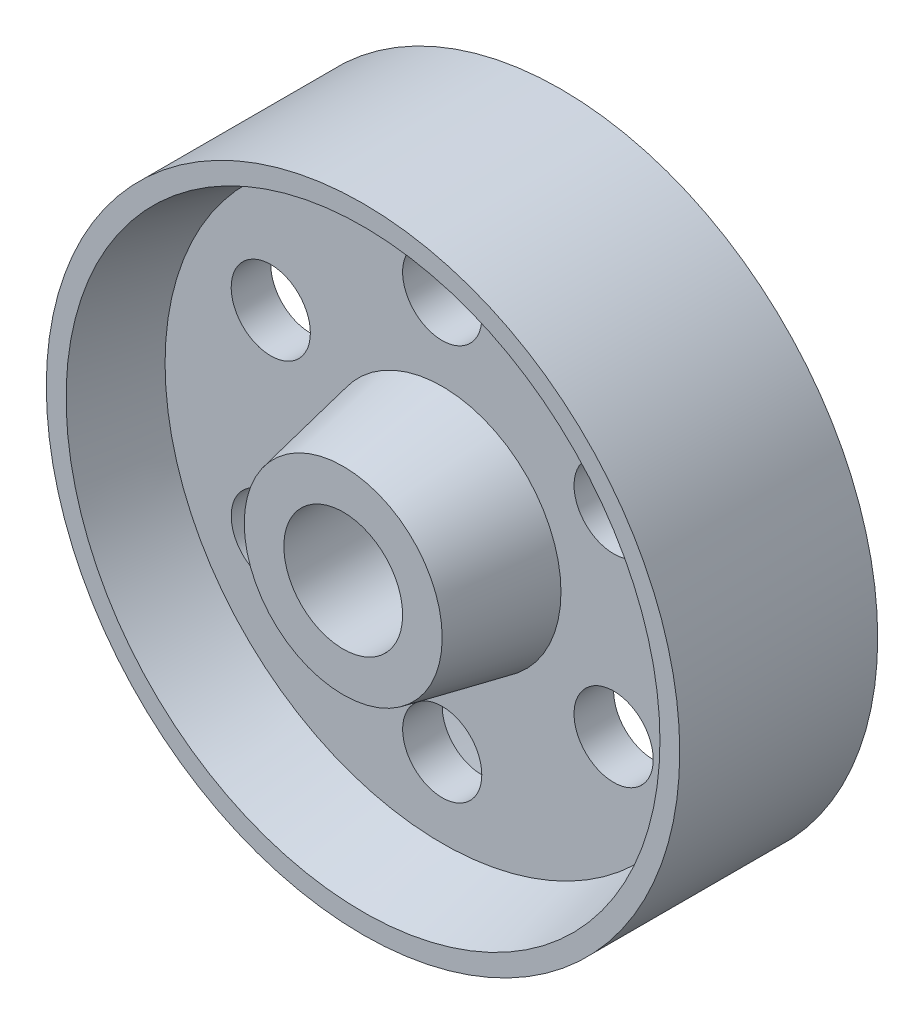
ISO-10303-21;
HEADER;
FILE_DESCRIPTION(('STEP AP214'),'2;1');
FILE_NAME('part.step','',(''),(''),'','','');
FILE_SCHEMA(('AUTOMOTIVE_DESIGN { 1 0 10303 214 1 1 1 1 }'));
ENDSEC;
DATA;
#1=APPLICATION_CONTEXT('core data for automotive mechanical design processes');
#2=APPLICATION_PROTOCOL_DEFINITION('international standard','automotive_design',2000,#1);
#3=PRODUCT_CONTEXT('',#1,'mechanical');
#4=PRODUCT('Part','Part','',(#3));
#5=PRODUCT_RELATED_PRODUCT_CATEGORY('part','',(#4));
#6=PRODUCT_DEFINITION_FORMATION('','',#4);
#7=PRODUCT_DEFINITION_CONTEXT('part definition',#1,'design');
#8=PRODUCT_DEFINITION('design','',#6,#7);
#9=PRODUCT_DEFINITION_SHAPE('','',#8);
#10=(LENGTH_UNIT() NAMED_UNIT(*) SI_UNIT(.MILLI.,.METRE.));
#11=(NAMED_UNIT(*) PLANE_ANGLE_UNIT() SI_UNIT($,.RADIAN.));
#12=(NAMED_UNIT(*) SI_UNIT($,.STERADIAN.) SOLID_ANGLE_UNIT());
#13=UNCERTAINTY_MEASURE_WITH_UNIT(LENGTH_MEASURE(1.E-05),#10,'distance_accuracy_value','');
#14=(GEOMETRIC_REPRESENTATION_CONTEXT(3) GLOBAL_UNCERTAINTY_ASSIGNED_CONTEXT((#13)) GLOBAL_UNIT_ASSIGNED_CONTEXT((#10,
#11,#12)) REPRESENTATION_CONTEXT('',''));
#15=CARTESIAN_POINT('',(0.,0.,0.));
#16=DIRECTION('',(0.,0.,1.));
#17=DIRECTION('',(1.,0.,0.));
#18=AXIS2_PLACEMENT_3D('',#15,#16,#17);
#19=CARTESIAN_POINT('',(0.,0.,37.3088610403316));
#20=DIRECTION('',(0.,0.,1.));
#21=DIRECTION('',(1.,0.,0.));
#22=AXIS2_PLACEMENT_3D('',#19,#20,#21);
#23=CYLINDRICAL_SURFACE('',#22,9.52500000000001);
#24=CARTESIAN_POINT('',(0.,0.,19.05));
#25=DIRECTION('',(0.,0.,1.));
#26=DIRECTION('',(1.,0.,0.));
#27=AXIS2_PLACEMENT_3D('',#24,#25,#26);
#28=CIRCLE('',#27,9.52500000000001);
#29=CARTESIAN_POINT('',(9.52500000000001,0.,19.05));
#30=VERTEX_POINT('',#29);
#31=EDGE_CURVE('E71',#30,#30,#28,.T.);
#32=ORIENTED_EDGE('',*,*,#31,.T.);
#33=EDGE_LOOP('',(#32));
#34=FACE_BOUND('',#33,.T.);
#35=CARTESIAN_POINT('',(0.,0.,-19.05));
#36=DIRECTION('',(0.,0.,1.));
#37=DIRECTION('',(1.,0.,0.));
#38=AXIS2_PLACEMENT_3D('',#35,#36,#37);
#39=CIRCLE('',#38,9.52500000000001);
#40=CARTESIAN_POINT('',(9.52500000000001,0.,-19.05));
#41=VERTEX_POINT('',#40);
#42=EDGE_CURVE('E10',#41,#41,#39,.T.);
#43=ORIENTED_EDGE('',*,*,#42,.F.);
#44=EDGE_LOOP('',(#43));
#45=FACE_BOUND('',#44,.T.);
#46=ADVANCED_FACE('F31',(#34,#45),#23,.F.);
#47=CARTESIAN_POINT('',(0.,0.,-19.05));
#48=DIRECTION('',(0.,0.,1.));
#49=DIRECTION('',(1.,0.,0.));
#50=AXIS2_PLACEMENT_3D('',#47,#48,#49);
#51=PLANE('',#50);
#52=CARTESIAN_POINT('',(0.,0.,-19.05));
#53=DIRECTION('',(0.,0.,1.));
#54=DIRECTION('',(1.,0.,0.));
#55=AXIS2_PLACEMENT_3D('',#52,#53,#54);
#56=CIRCLE('',#55,15.875);
#57=CARTESIAN_POINT('',(15.875,0.,-19.05));
#58=VERTEX_POINT('',#57);
#59=EDGE_CURVE('E37',#58,#58,#56,.T.);
#60=ORIENTED_EDGE('',*,*,#59,.F.);
#61=EDGE_LOOP('',(#60));
#62=FACE_BOUND('',#61,.T.);
#63=ORIENTED_EDGE('',*,*,#42,.T.);
#64=EDGE_LOOP('',(#63));
#65=FACE_BOUND('',#64,.T.);
#66=ADVANCED_FACE('F143',(#62,#65),#51,.F.);
#67=CARTESIAN_POINT('',(0.,0.,-19.05));
#68=DIRECTION('',(0.,0.,1.));
#69=DIRECTION('',(1.,0.,0.));
#70=AXIS2_PLACEMENT_3D('',#67,#68,#69);
#71=CONICAL_SURFACE('',#70,15.875,0.197395559849881);
#72=CARTESIAN_POINT('',(0.,0.,-3.175));
#73=DIRECTION('',(0.,0.,1.));
#74=DIRECTION('',(1.,0.,0.));
#75=AXIS2_PLACEMENT_3D('',#72,#73,#74);
#76=CIRCLE('',#75,19.05);
#77=CARTESIAN_POINT('',(19.05,0.,-3.175));
#78=VERTEX_POINT('',#77);
#79=EDGE_CURVE('E41',#78,#78,#76,.T.);
#80=ORIENTED_EDGE('',*,*,#79,.F.);
#81=EDGE_LOOP('',(#80));
#82=FACE_BOUND('',#81,.T.);
#83=ORIENTED_EDGE('',*,*,#59,.T.);
#84=EDGE_LOOP('',(#83));
#85=FACE_BOUND('',#84,.T.);
#86=ADVANCED_FACE('F147',(#82,#85),#71,.T.);
#87=CARTESIAN_POINT('',(0.,0.,-3.175));
#88=DIRECTION('',(0.,0.,1.));
#89=DIRECTION('',(1.,0.,0.));
#90=AXIS2_PLACEMENT_3D('',#87,#88,#89);
#91=PLANE('',#90);
#92=CARTESIAN_POINT('',(27.4963065701557,15.8750000000003,-3.175));
#93=DIRECTION('',(0.,0.,1.));
#94=DIRECTION('',(1.,0.,0.));
#95=AXIS2_PLACEMENT_3D('',#92,#93,#94);
#96=CIRCLE('',#95,6.35);
#97=CARTESIAN_POINT('',(33.8463065701557,15.8750000000003,-3.175));
#98=VERTEX_POINT('',#97);
#99=EDGE_CURVE('E80',#98,#98,#96,.T.);
#100=ORIENTED_EDGE('',*,*,#99,.T.);
#101=EDGE_LOOP('',(#100));
#102=FACE_BOUND('',#101,.T.);
#103=CARTESIAN_POINT('',(27.4963065701561,-15.8749999999997,-3.175));
#104=DIRECTION('',(0.,0.,1.));
#105=DIRECTION('',(1.,0.,0.));
#106=AXIS2_PLACEMENT_3D('',#103,#104,#105);
#107=CIRCLE('',#106,6.35);
#108=CARTESIAN_POINT('',(33.8463065701561,-15.8749999999997,-3.175));
#109=VERTEX_POINT('',#108);
#110=EDGE_CURVE('E83',#109,#109,#107,.T.);
#111=ORIENTED_EDGE('',*,*,#110,.T.);
#112=EDGE_LOOP('',(#111));
#113=FACE_BOUND('',#112,.T.);
#114=CARTESIAN_POINT('',(0.,-31.75,-3.175));
#115=DIRECTION('',(0.,0.,1.));
#116=DIRECTION('',(1.,0.,0.));
#117=AXIS2_PLACEMENT_3D('',#114,#115,#116);
#118=CIRCLE('',#117,6.35);
#119=CARTESIAN_POINT('',(6.35,-31.75,-3.175));
#120=VERTEX_POINT('',#119);
#121=EDGE_CURVE('E86',#120,#120,#118,.T.);
#122=ORIENTED_EDGE('',*,*,#121,.T.);
#123=EDGE_LOOP('',(#122));
#124=FACE_BOUND('',#123,.T.);
#125=CARTESIAN_POINT('',(-27.4963065701559,-15.8750000000001,-3.175));
#126=DIRECTION('',(0.,0.,1.));
#127=DIRECTION('',(1.,0.,0.));
#128=AXIS2_PLACEMENT_3D('',#125,#126,#127);
#129=CIRCLE('',#128,6.35);
#130=CARTESIAN_POINT('',(-21.1463065701559,-15.8750000000001,-3.175));
#131=VERTEX_POINT('',#130);
#132=EDGE_CURVE('E89',#131,#131,#129,.T.);
#133=ORIENTED_EDGE('',*,*,#132,.T.);
#134=EDGE_LOOP('',(#133));
#135=FACE_BOUND('',#134,.T.);
#136=CARTESIAN_POINT('',(-27.496306570156,15.8749999999999,-3.175));
#137=DIRECTION('',(0.,0.,1.));
#138=DIRECTION('',(1.,0.,0.));
#139=AXIS2_PLACEMENT_3D('',#136,#137,#138);
#140=CIRCLE('',#139,6.35);
#141=CARTESIAN_POINT('',(-21.146306570156,15.8749999999999,-3.175));
#142=VERTEX_POINT('',#141);
#143=EDGE_CURVE('E92',#142,#142,#140,.T.);
#144=ORIENTED_EDGE('',*,*,#143,.T.);
#145=EDGE_LOOP('',(#144));
#146=FACE_BOUND('',#145,.T.);
#147=CARTESIAN_POINT('',(0.,31.75,-3.175));
#148=DIRECTION('',(0.,0.,1.));
#149=DIRECTION('',(1.,0.,0.));
#150=AXIS2_PLACEMENT_3D('',#147,#148,#149);
#151=CIRCLE('',#150,6.35);
#152=CARTESIAN_POINT('',(6.35,31.75,-3.175));
#153=VERTEX_POINT('',#152);
#154=EDGE_CURVE('E74',#153,#153,#151,.T.);
#155=ORIENTED_EDGE('',*,*,#154,.T.);
#156=EDGE_LOOP('',(#155));
#157=FACE_BOUND('',#156,.T.);
#158=CARTESIAN_POINT('',(0.,0.,-3.175));
#159=DIRECTION('',(0.,0.,1.));
#160=DIRECTION('',(1.,0.,0.));
#161=AXIS2_PLACEMENT_3D('',#158,#159,#160);
#162=CIRCLE('',#161,44.45);
#163=CARTESIAN_POINT('',(44.45,0.,-3.175));
#164=VERTEX_POINT('',#163);
#165=EDGE_CURVE('E45',#164,#164,#162,.T.);
#166=ORIENTED_EDGE('',*,*,#165,.F.);
#167=EDGE_LOOP('',(#166));
#168=FACE_BOUND('',#167,.T.);
#169=ORIENTED_EDGE('',*,*,#79,.T.);
#170=EDGE_LOOP('',(#169));
#171=FACE_BOUND('',#170,.T.);
#172=ADVANCED_FACE('F152',(#102,#113,#124,#135,#146,#157,#168,#171),#91,.F.);
#173=CARTESIAN_POINT('',(0.,0.,-3.175));
#174=DIRECTION('',(0.,0.,-1.));
#175=DIRECTION('',(-1.,0.,0.));
#176=AXIS2_PLACEMENT_3D('',#173,#174,#175);
#177=CONICAL_SURFACE('',#176,44.45,0.244978663126864);
#178=CARTESIAN_POINT('',(0.,0.,-15.875));
#179=DIRECTION('',(0.,0.,1.));
#180=DIRECTION('',(1.,0.,0.));
#181=AXIS2_PLACEMENT_3D('',#178,#179,#180);
#182=CIRCLE('',#181,47.625);
#183=CARTESIAN_POINT('',(47.625,0.,-15.875));
#184=VERTEX_POINT('',#183);
#185=EDGE_CURVE('E50',#184,#184,#182,.T.);
#186=ORIENTED_EDGE('',*,*,#185,.F.);
#187=EDGE_LOOP('',(#186));
#188=FACE_BOUND('',#187,.T.);
#189=ORIENTED_EDGE('',*,*,#165,.T.);
#190=EDGE_LOOP('',(#189));
#191=FACE_BOUND('',#190,.T.);
#192=ADVANCED_FACE('F158',(#188,#191),#177,.F.);
#193=CARTESIAN_POINT('',(0.,0.,-15.875));
#194=DIRECTION('',(0.,0.,1.));
#195=DIRECTION('',(1.,0.,0.));
#196=AXIS2_PLACEMENT_3D('',#193,#194,#195);
#197=PLANE('',#196);
#198=CARTESIAN_POINT('',(0.,0.,-15.875));
#199=DIRECTION('',(0.,0.,1.));
#200=DIRECTION('',(1.,0.,0.));
#201=AXIS2_PLACEMENT_3D('',#198,#199,#200);
#202=CIRCLE('',#201,50.8);
#203=CARTESIAN_POINT('',(50.8,0.,-15.875));
#204=VERTEX_POINT('',#203);
#205=EDGE_CURVE('E53',#204,#204,#202,.T.);
#206=ORIENTED_EDGE('',*,*,#205,.F.);
#207=EDGE_LOOP('',(#206));
#208=FACE_BOUND('',#207,.T.);
#209=ORIENTED_EDGE('',*,*,#185,.T.);
#210=EDGE_LOOP('',(#209));
#211=FACE_BOUND('',#210,.T.);
#212=ADVANCED_FACE('F162',(#208,#211),#197,.F.);
#213=CARTESIAN_POINT('',(0.,0.,37.3088610403316));
#214=DIRECTION('',(0.,0.,1.));
#215=DIRECTION('',(1.,0.,0.));
#216=AXIS2_PLACEMENT_3D('',#213,#214,#215);
#217=CYLINDRICAL_SURFACE('',#216,50.8);
#218=ORIENTED_EDGE('',*,*,#205,.T.);
#219=EDGE_LOOP('',(#218));
#220=FACE_BOUND('',#219,.T.);
#221=CARTESIAN_POINT('',(0.,0.,15.875));
#222=DIRECTION('',(0.,0.,1.));
#223=DIRECTION('',(1.,0.,0.));
#224=AXIS2_PLACEMENT_3D('',#221,#222,#223);
#225=CIRCLE('',#224,50.8);
#226=CARTESIAN_POINT('',(50.8,0.,15.875));
#227=VERTEX_POINT('',#226);
#228=EDGE_CURVE('E56',#227,#227,#225,.T.);
#229=ORIENTED_EDGE('',*,*,#228,.F.);
#230=EDGE_LOOP('',(#229));
#231=FACE_BOUND('',#230,.T.);
#232=ADVANCED_FACE('F166',(#220,#231),#217,.T.);
#233=CARTESIAN_POINT('',(0.,0.,15.875));
#234=DIRECTION('',(0.,0.,1.));
#235=DIRECTION('',(1.,0.,0.));
#236=AXIS2_PLACEMENT_3D('',#233,#234,#235);
#237=PLANE('',#236);
#238=ORIENTED_EDGE('',*,*,#228,.T.);
#239=EDGE_LOOP('',(#238));
#240=FACE_BOUND('',#239,.T.);
#241=CARTESIAN_POINT('',(0.,0.,15.875));
#242=DIRECTION('',(0.,0.,1.));
#243=DIRECTION('',(1.,0.,0.));
#244=AXIS2_PLACEMENT_3D('',#241,#242,#243);
#245=CIRCLE('',#244,47.625);
#246=CARTESIAN_POINT('',(47.625,0.,15.875));
#247=VERTEX_POINT('',#246);
#248=EDGE_CURVE('E59',#247,#247,#245,.T.);
#249=ORIENTED_EDGE('',*,*,#248,.F.);
#250=EDGE_LOOP('',(#249));
#251=FACE_BOUND('',#250,.T.);
#252=ADVANCED_FACE('F170',(#240,#251),#237,.T.);
#253=CARTESIAN_POINT('',(0.,0.,3.175));
#254=DIRECTION('',(0.,0.,1.));
#255=DIRECTION('',(1.,0.,0.));
#256=AXIS2_PLACEMENT_3D('',#253,#254,#255);
#257=CONICAL_SURFACE('',#256,44.45,0.244978663126865);
#258=ORIENTED_EDGE('',*,*,#248,.T.);
#259=EDGE_LOOP('',(#258));
#260=FACE_BOUND('',#259,.T.);
#261=CARTESIAN_POINT('',(0.,0.,3.175));
#262=DIRECTION('',(0.,0.,1.));
#263=DIRECTION('',(1.,0.,0.));
#264=AXIS2_PLACEMENT_3D('',#261,#262,#263);
#265=CIRCLE('',#264,44.45);
#266=CARTESIAN_POINT('',(44.45,0.,3.175));
#267=VERTEX_POINT('',#266);
#268=EDGE_CURVE('E62',#267,#267,#265,.T.);
#269=ORIENTED_EDGE('',*,*,#268,.F.);
#270=EDGE_LOOP('',(#269));
#271=FACE_BOUND('',#270,.T.);
#272=ADVANCED_FACE('F118',(#260,#271),#257,.F.);
#273=CARTESIAN_POINT('',(0.,0.,3.175));
#274=DIRECTION('',(0.,0.,1.));
#275=DIRECTION('',(1.,0.,0.));
#276=AXIS2_PLACEMENT_3D('',#273,#274,#275);
#277=PLANE('',#276);
#278=CARTESIAN_POINT('',(27.4963065701557,15.8750000000003,3.175));
#279=DIRECTION('',(0.,0.,1.));
#280=DIRECTION('',(0.50000000000001,-0.866025403784433,0.));
#281=AXIS2_PLACEMENT_3D('',#278,#279,#280);
#282=CIRCLE('',#281,6.35);
#283=CARTESIAN_POINT('',(30.6713065701558,10.3757386859692,3.175));
#284=VERTEX_POINT('',#283);
#285=EDGE_CURVE('E99',#284,#284,#282,.T.);
#286=ORIENTED_EDGE('',*,*,#285,.F.);
#287=EDGE_LOOP('',(#286));
#288=FACE_BOUND('',#287,.T.);
#289=CARTESIAN_POINT('',(27.4963065701561,-15.8749999999997,3.175));
#290=DIRECTION('',(0.,0.,1.));
#291=DIRECTION('',(-0.499999999999992,-0.866025403784443,0.));
#292=AXIS2_PLACEMENT_3D('',#289,#290,#291);
#293=CIRCLE('',#292,6.35);
#294=CARTESIAN_POINT('',(24.3213065701561,-21.374261314031,3.175));
#295=VERTEX_POINT('',#294);
#296=EDGE_CURVE('E102',#295,#295,#293,.T.);
#297=ORIENTED_EDGE('',*,*,#296,.F.);
#298=EDGE_LOOP('',(#297));
#299=FACE_BOUND('',#298,.T.);
#300=CARTESIAN_POINT('',(0.,-31.75,3.175));
#301=DIRECTION('',(0.,0.,1.));
#302=DIRECTION('',(-1.,0.,0.));
#303=AXIS2_PLACEMENT_3D('',#300,#301,#302);
#304=CIRCLE('',#303,6.35);
#305=CARTESIAN_POINT('',(-6.35,-31.75,3.175));
#306=VERTEX_POINT('',#305);
#307=EDGE_CURVE('E105',#306,#306,#304,.T.);
#308=ORIENTED_EDGE('',*,*,#307,.F.);
#309=EDGE_LOOP('',(#308));
#310=FACE_BOUND('',#309,.T.);
#311=CARTESIAN_POINT('',(-27.4963065701559,-15.8750000000001,3.175));
#312=DIRECTION('',(0.,0.,1.));
#313=DIRECTION('',(-0.500000000000004,0.866025403784436,0.));
#314=AXIS2_PLACEMENT_3D('',#311,#312,#313);
#315=CIRCLE('',#314,6.35);
#316=CARTESIAN_POINT('',(-30.6713065701559,-10.375738685969,3.175));
#317=VERTEX_POINT('',#316);
#318=EDGE_CURVE('E98',#317,#317,#315,.T.);
#319=ORIENTED_EDGE('',*,*,#318,.F.);
#320=EDGE_LOOP('',(#319));
#321=FACE_BOUND('',#320,.T.);
#322=CARTESIAN_POINT('',(-27.496306570156,15.8749999999999,3.175));
#323=DIRECTION('',(0.,0.,1.));
#324=DIRECTION('',(0.499999999999998,0.86602540378444,0.));
#325=AXIS2_PLACEMENT_3D('',#322,#323,#324);
#326=CIRCLE('',#325,6.35);
#327=CARTESIAN_POINT('',(-24.321306570156,21.3742613140311,3.175));
#328=VERTEX_POINT('',#327);
#329=EDGE_CURVE('E95',#328,#328,#326,.T.);
#330=ORIENTED_EDGE('',*,*,#329,.F.);
#331=EDGE_LOOP('',(#330));
#332=FACE_BOUND('',#331,.T.);
#333=CARTESIAN_POINT('',(0.,31.75,3.175));
#334=DIRECTION('',(0.,0.,1.));
#335=DIRECTION('',(1.,0.,0.));
#336=AXIS2_PLACEMENT_3D('',#333,#334,#335);
#337=CIRCLE('',#336,6.35);
#338=CARTESIAN_POINT('',(6.35,31.75,3.175));
#339=VERTEX_POINT('',#338);
#340=EDGE_CURVE('E77',#339,#339,#337,.T.);
#341=ORIENTED_EDGE('',*,*,#340,.F.);
#342=EDGE_LOOP('',(#341));
#343=FACE_BOUND('',#342,.T.);
#344=ORIENTED_EDGE('',*,*,#268,.T.);
#345=EDGE_LOOP('',(#344));
#346=FACE_BOUND('',#345,.T.);
#347=CARTESIAN_POINT('',(0.,0.,3.175));
#348=DIRECTION('',(0.,0.,1.));
#349=DIRECTION('',(1.,0.,0.));
#350=AXIS2_PLACEMENT_3D('',#347,#348,#349);
#351=CIRCLE('',#350,19.05);
#352=CARTESIAN_POINT('',(19.05,0.,3.175));
#353=VERTEX_POINT('',#352);
#354=EDGE_CURVE('E65',#353,#353,#351,.T.);
#355=ORIENTED_EDGE('',*,*,#354,.F.);
#356=EDGE_LOOP('',(#355));
#357=FACE_BOUND('',#356,.T.);
#358=ADVANCED_FACE('F114',(#288,#299,#310,#321,#332,#343,#346,#357),#277,.T.);
#359=CARTESIAN_POINT('',(0.,0.,19.05));
#360=DIRECTION('',(0.,0.,-1.));
#361=DIRECTION('',(-1.,0.,0.));
#362=AXIS2_PLACEMENT_3D('',#359,#360,#361);
#363=CONICAL_SURFACE('',#362,15.875,0.197395559849881);
#364=ORIENTED_EDGE('',*,*,#354,.T.);
#365=EDGE_LOOP('',(#364));
#366=FACE_BOUND('',#365,.T.);
#367=CARTESIAN_POINT('',(0.,0.,19.05));
#368=DIRECTION('',(0.,0.,1.));
#369=DIRECTION('',(1.,0.,0.));
#370=AXIS2_PLACEMENT_3D('',#367,#368,#369);
#371=CIRCLE('',#370,15.875);
#372=CARTESIAN_POINT('',(15.875,0.,19.05));
#373=VERTEX_POINT('',#372);
#374=EDGE_CURVE('E68',#373,#373,#371,.T.);
#375=ORIENTED_EDGE('',*,*,#374,.F.);
#376=EDGE_LOOP('',(#375));
#377=FACE_BOUND('',#376,.T.);
#378=ADVANCED_FACE('F117',(#366,#377),#363,.T.);
#379=CARTESIAN_POINT('',(0.,0.,19.05));
#380=DIRECTION('',(0.,0.,1.));
#381=DIRECTION('',(1.,0.,0.));
#382=AXIS2_PLACEMENT_3D('',#379,#380,#381);
#383=PLANE('',#382);
#384=ORIENTED_EDGE('',*,*,#374,.T.);
#385=EDGE_LOOP('',(#384));
#386=FACE_BOUND('',#385,.T.);
#387=ORIENTED_EDGE('',*,*,#31,.F.);
#388=EDGE_LOOP('',(#387));
#389=FACE_BOUND('',#388,.T.);
#390=ADVANCED_FACE('F131',(#386,#389),#383,.T.);
#391=CARTESIAN_POINT('',(0.,31.75,-19.05));
#392=DIRECTION('',(0.,0.,1.));
#393=DIRECTION('',(1.,0.,0.));
#394=AXIS2_PLACEMENT_3D('',#391,#392,#393);
#395=CYLINDRICAL_SURFACE('',#394,6.35);
#396=ORIENTED_EDGE('',*,*,#340,.T.);
#397=EDGE_LOOP('',(#396));
#398=FACE_BOUND('',#397,.T.);
#399=ORIENTED_EDGE('',*,*,#154,.F.);
#400=EDGE_LOOP('',(#399));
#401=FACE_BOUND('',#400,.T.);
#402=ADVANCED_FACE('F137',(#398,#401),#395,.F.);
#403=CARTESIAN_POINT('',(-27.496306570156,15.8749999999999,-19.05));
#404=DIRECTION('',(0.,0.,1.));
#405=DIRECTION('',(1.,0.,0.));
#406=AXIS2_PLACEMENT_3D('',#403,#404,#405);
#407=CYLINDRICAL_SURFACE('',#406,6.35);
#408=ORIENTED_EDGE('',*,*,#329,.T.);
#409=EDGE_LOOP('',(#408));
#410=FACE_BOUND('',#409,.T.);
#411=ORIENTED_EDGE('',*,*,#143,.F.);
#412=EDGE_LOOP('',(#411));
#413=FACE_BOUND('',#412,.T.);
#414=ADVANCED_FACE('F180',(#410,#413),#407,.F.);
#415=CARTESIAN_POINT('',(-27.4963065701559,-15.8750000000001,-19.05));
#416=DIRECTION('',(0.,0.,1.));
#417=DIRECTION('',(1.,0.,0.));
#418=AXIS2_PLACEMENT_3D('',#415,#416,#417);
#419=CYLINDRICAL_SURFACE('',#418,6.35);
#420=ORIENTED_EDGE('',*,*,#318,.T.);
#421=EDGE_LOOP('',(#420));
#422=FACE_BOUND('',#421,.T.);
#423=ORIENTED_EDGE('',*,*,#132,.F.);
#424=EDGE_LOOP('',(#423));
#425=FACE_BOUND('',#424,.T.);
#426=ADVANCED_FACE('F111',(#422,#425),#419,.F.);
#427=CARTESIAN_POINT('',(0.,-31.75,-19.05));
#428=DIRECTION('',(0.,0.,1.));
#429=DIRECTION('',(1.,0.,0.));
#430=AXIS2_PLACEMENT_3D('',#427,#428,#429);
#431=CYLINDRICAL_SURFACE('',#430,6.35);
#432=ORIENTED_EDGE('',*,*,#307,.T.);
#433=EDGE_LOOP('',(#432));
#434=FACE_BOUND('',#433,.T.);
#435=ORIENTED_EDGE('',*,*,#121,.F.);
#436=EDGE_LOOP('',(#435));
#437=FACE_BOUND('',#436,.T.);
#438=ADVANCED_FACE('F192',(#434,#437),#431,.F.);
#439=CARTESIAN_POINT('',(27.4963065701561,-15.8749999999997,-19.05));
#440=DIRECTION('',(0.,0.,1.));
#441=DIRECTION('',(1.,0.,0.));
#442=AXIS2_PLACEMENT_3D('',#439,#440,#441);
#443=CYLINDRICAL_SURFACE('',#442,6.35);
#444=ORIENTED_EDGE('',*,*,#296,.T.);
#445=EDGE_LOOP('',(#444));
#446=FACE_BOUND('',#445,.T.);
#447=ORIENTED_EDGE('',*,*,#110,.F.);
#448=EDGE_LOOP('',(#447));
#449=FACE_BOUND('',#448,.T.);
#450=ADVANCED_FACE('F188',(#446,#449),#443,.F.);
#451=CARTESIAN_POINT('',(27.4963065701557,15.8750000000003,-19.05));
#452=DIRECTION('',(0.,0.,1.));
#453=DIRECTION('',(1.,0.,0.));
#454=AXIS2_PLACEMENT_3D('',#451,#452,#453);
#455=CYLINDRICAL_SURFACE('',#454,6.35);
#456=ORIENTED_EDGE('',*,*,#285,.T.);
#457=EDGE_LOOP('',(#456));
#458=FACE_BOUND('',#457,.T.);
#459=ORIENTED_EDGE('',*,*,#99,.F.);
#460=EDGE_LOOP('',(#459));
#461=FACE_BOUND('',#460,.T.);
#462=ADVANCED_FACE('F185',(#458,#461),#455,.F.);
#463=CLOSED_SHELL('',(#46,#66,#86,#172,#192,#212,#232,#252,#272,#358,#378,#390,#402,#414,#426,
#438,#450,#462));
#464=MANIFOLD_SOLID_BREP('B2',#463);
#465=ADVANCED_BREP_SHAPE_REPRESENTATION('',(#18,#464),#14);
#466=SHAPE_DEFINITION_REPRESENTATION(#9,#465);
ENDSEC;
END-ISO-10303-21;
